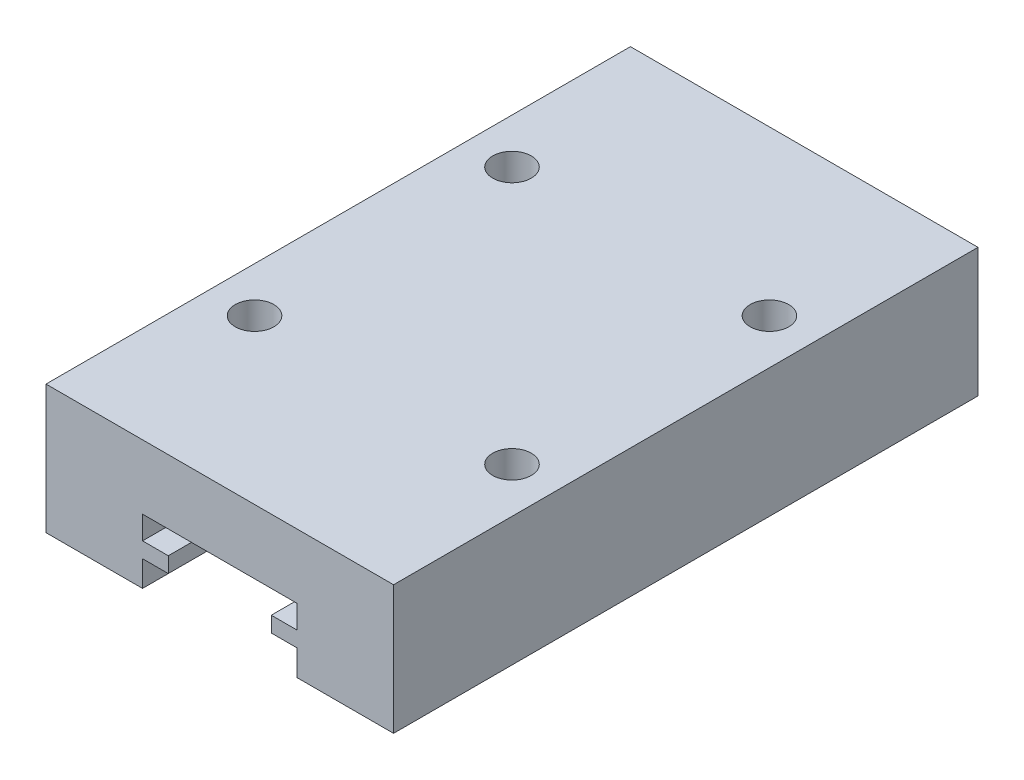
ISO-10303-21;
HEADER;
FILE_DESCRIPTION(('STEP AP214'),'2;1');
FILE_NAME('part.step','',(''),(''),'','','');
FILE_SCHEMA(('AUTOMOTIVE_DESIGN { 1 0 10303 214 1 1 1 1 }'));
ENDSEC;
DATA;
#1=APPLICATION_CONTEXT('core data for automotive mechanical design processes');
#2=APPLICATION_PROTOCOL_DEFINITION('international standard','automotive_design',2000,#1);
#3=PRODUCT_CONTEXT('',#1,'mechanical');
#4=PRODUCT('Part','Part','',(#3));
#5=PRODUCT_RELATED_PRODUCT_CATEGORY('part','',(#4));
#6=PRODUCT_DEFINITION_FORMATION('','',#4);
#7=PRODUCT_DEFINITION_CONTEXT('part definition',#1,'design');
#8=PRODUCT_DEFINITION('design','',#6,#7);
#9=PRODUCT_DEFINITION_SHAPE('','',#8);
#10=(LENGTH_UNIT() NAMED_UNIT(*) SI_UNIT(.MILLI.,.METRE.));
#11=(NAMED_UNIT(*) PLANE_ANGLE_UNIT() SI_UNIT($,.RADIAN.));
#12=(NAMED_UNIT(*) SI_UNIT($,.STERADIAN.) SOLID_ANGLE_UNIT());
#13=UNCERTAINTY_MEASURE_WITH_UNIT(LENGTH_MEASURE(1.E-05),#10,'distance_accuracy_value','');
#14=(GEOMETRIC_REPRESENTATION_CONTEXT(3) GLOBAL_UNCERTAINTY_ASSIGNED_CONTEXT((#13)) GLOBAL_UNIT_ASSIGNED_CONTEXT((#10,
#11,#12)) REPRESENTATION_CONTEXT('',''));
#15=CARTESIAN_POINT('',(0.,0.,0.));
#16=DIRECTION('',(0.,0.,1.));
#17=DIRECTION('',(1.,0.,0.));
#18=AXIS2_PLACEMENT_3D('',#15,#16,#17);
#19=CARTESIAN_POINT('',(-22.7955095785439,0.,45.4));
#20=DIRECTION('',(1.,0.,0.));
#21=DIRECTION('',(0.,0.,-1.));
#22=AXIS2_PLACEMENT_3D('',#19,#20,#21);
#23=PLANE('',#22);
#24=DIRECTION('',(0.,-1.,0.));
#25=VECTOR('',#24,1.);
#26=CARTESIAN_POINT('',(-22.7955095785439,0.,0.));
#27=LINE('',#26,#25);
#28=CARTESIAN_POINT('',(-22.7955095785439,10.,0.));
#29=VERTEX_POINT('',#28);
#30=CARTESIAN_POINT('',(-22.7955095785439,0.,0.));
#31=VERTEX_POINT('',#30);
#32=EDGE_CURVE('E180',#29,#31,#27,.T.);
#33=ORIENTED_EDGE('',*,*,#32,.T.);
#34=DIRECTION('',(0.,0.,-1.));
#35=VECTOR('',#34,1.);
#36=CARTESIAN_POINT('',(-22.7955095785439,0.,45.4));
#37=LINE('',#36,#35);
#38=CARTESIAN_POINT('',(-22.7955095785439,0.,45.4));
#39=VERTEX_POINT('',#38);
#40=EDGE_CURVE('E11',#39,#31,#37,.T.);
#41=ORIENTED_EDGE('',*,*,#40,.F.);
#42=DIRECTION('',(0.,-1.,0.));
#43=VECTOR('',#42,1.);
#44=CARTESIAN_POINT('',(-22.7955095785439,0.,45.4));
#45=LINE('',#44,#43);
#46=CARTESIAN_POINT('',(-22.7955095785439,10.,45.4));
#47=VERTEX_POINT('',#46);
#48=EDGE_CURVE('E211',#47,#39,#45,.T.);
#49=ORIENTED_EDGE('',*,*,#48,.F.);
#50=DIRECTION('',(0.,0.,-1.));
#51=VECTOR('',#50,1.);
#52=CARTESIAN_POINT('',(-22.7955095785439,10.,45.4));
#53=LINE('',#52,#51);
#54=EDGE_CURVE('E176',#47,#29,#53,.T.);
#55=ORIENTED_EDGE('',*,*,#54,.T.);
#56=EDGE_LOOP('',(#33,#41,#49,#55));
#57=FACE_BOUND('',#56,.T.);
#58=ADVANCED_FACE('F36',(#57),#23,.F.);
#59=CARTESIAN_POINT('',(-15.2955095785439,0.,45.4));
#60=DIRECTION('',(0.,1.,0.));
#61=DIRECTION('',(-1.,0.,0.));
#62=AXIS2_PLACEMENT_3D('',#59,#60,#61);
#63=PLANE('',#62);
#64=DIRECTION('',(1.,0.,0.));
#65=VECTOR('',#64,1.);
#66=CARTESIAN_POINT('',(-15.2955095785439,0.,0.));
#67=LINE('',#66,#65);
#68=CARTESIAN_POINT('',(-15.2955095785439,0.,0.));
#69=VERTEX_POINT('',#68);
#70=EDGE_CURVE('E183',#31,#69,#67,.T.);
#71=ORIENTED_EDGE('',*,*,#70,.T.);
#72=DIRECTION('',(0.,0.,-1.));
#73=VECTOR('',#72,1.);
#74=CARTESIAN_POINT('',(-15.2955095785439,0.,45.4));
#75=LINE('',#74,#73);
#76=CARTESIAN_POINT('',(-15.2955095785439,0.,45.4));
#77=VERTEX_POINT('',#76);
#78=EDGE_CURVE('E44',#77,#69,#75,.T.);
#79=ORIENTED_EDGE('',*,*,#78,.F.);
#80=DIRECTION('',(1.,0.,0.));
#81=VECTOR('',#80,1.);
#82=CARTESIAN_POINT('',(-15.2955095785439,0.,45.4));
#83=LINE('',#82,#81);
#84=EDGE_CURVE('E119',#39,#77,#83,.T.);
#85=ORIENTED_EDGE('',*,*,#84,.F.);
#86=ORIENTED_EDGE('',*,*,#40,.T.);
#87=EDGE_LOOP('',(#71,#79,#85,#86));
#88=FACE_BOUND('',#87,.T.);
#89=ADVANCED_FACE('F312',(#88),#63,.F.);
#90=CARTESIAN_POINT('',(-15.2955095785439,2.,45.4));
#91=DIRECTION('',(-1.,0.,0.));
#92=DIRECTION('',(0.,-1.,0.));
#93=AXIS2_PLACEMENT_3D('',#90,#91,#92);
#94=PLANE('',#93);
#95=DIRECTION('',(0.,1.,0.));
#96=VECTOR('',#95,1.);
#97=CARTESIAN_POINT('',(-15.2955095785439,2.,0.));
#98=LINE('',#97,#96);
#99=CARTESIAN_POINT('',(-15.2955095785439,2.,0.));
#100=VERTEX_POINT('',#99);
#101=EDGE_CURVE('E186',#69,#100,#98,.T.);
#102=ORIENTED_EDGE('',*,*,#101,.T.);
#103=DIRECTION('',(0.,0.,-1.));
#104=VECTOR('',#103,1.);
#105=CARTESIAN_POINT('',(-15.2955095785439,2.,45.4));
#106=LINE('',#105,#104);
#107=CARTESIAN_POINT('',(-15.2955095785439,2.,45.4));
#108=VERTEX_POINT('',#107);
#109=EDGE_CURVE('E242',#108,#100,#106,.T.);
#110=ORIENTED_EDGE('',*,*,#109,.F.);
#111=DIRECTION('',(0.,1.,0.));
#112=VECTOR('',#111,1.);
#113=CARTESIAN_POINT('',(-15.2955095785439,2.,45.4));
#114=LINE('',#113,#112);
#115=EDGE_CURVE('E250',#77,#108,#114,.T.);
#116=ORIENTED_EDGE('',*,*,#115,.F.);
#117=ORIENTED_EDGE('',*,*,#78,.T.);
#118=EDGE_LOOP('',(#102,#110,#116,#117));
#119=FACE_BOUND('',#118,.T.);
#120=ADVANCED_FACE('F248',(#119),#94,.F.);
#121=CARTESIAN_POINT('',(-13.2955095785439,2.,45.4));
#122=DIRECTION('',(0.,1.,0.));
#123=DIRECTION('',(0.,0.,1.));
#124=AXIS2_PLACEMENT_3D('',#121,#122,#123);
#125=PLANE('',#124);
#126=DIRECTION('',(1.,0.,0.));
#127=VECTOR('',#126,1.);
#128=CARTESIAN_POINT('',(-13.2955095785439,2.,0.));
#129=LINE('',#128,#127);
#130=CARTESIAN_POINT('',(-13.2955095785439,2.,0.));
#131=VERTEX_POINT('',#130);
#132=EDGE_CURVE('E188',#100,#131,#129,.T.);
#133=ORIENTED_EDGE('',*,*,#132,.T.);
#134=DIRECTION('',(0.,0.,-1.));
#135=VECTOR('',#134,1.);
#136=CARTESIAN_POINT('',(-13.2955095785439,2.,45.4));
#137=LINE('',#136,#135);
#138=CARTESIAN_POINT('',(-13.2955095785439,2.,45.4));
#139=VERTEX_POINT('',#138);
#140=EDGE_CURVE('E239',#139,#131,#137,.T.);
#141=ORIENTED_EDGE('',*,*,#140,.F.);
#142=DIRECTION('',(1.,0.,0.));
#143=VECTOR('',#142,1.);
#144=CARTESIAN_POINT('',(-13.2955095785439,2.,45.4));
#145=LINE('',#144,#143);
#146=EDGE_CURVE('E268',#108,#139,#145,.T.);
#147=ORIENTED_EDGE('',*,*,#146,.F.);
#148=ORIENTED_EDGE('',*,*,#109,.T.);
#149=EDGE_LOOP('',(#133,#141,#147,#148));
#150=FACE_BOUND('',#149,.T.);
#151=ADVANCED_FACE('F259',(#150),#125,.F.);
#152=CARTESIAN_POINT('',(-13.2955095785439,3.2,45.4));
#153=DIRECTION('',(-1.,0.,0.));
#154=DIRECTION('',(0.,-1.,0.));
#155=AXIS2_PLACEMENT_3D('',#152,#153,#154);
#156=PLANE('',#155);
#157=DIRECTION('',(0.,1.,0.));
#158=VECTOR('',#157,1.);
#159=CARTESIAN_POINT('',(-13.2955095785439,3.2,0.));
#160=LINE('',#159,#158);
#161=CARTESIAN_POINT('',(-13.2955095785439,3.2,0.));
#162=VERTEX_POINT('',#161);
#163=EDGE_CURVE('E190',#131,#162,#160,.T.);
#164=ORIENTED_EDGE('',*,*,#163,.T.);
#165=DIRECTION('',(0.,0.,-1.));
#166=VECTOR('',#165,1.);
#167=CARTESIAN_POINT('',(-13.2955095785439,3.2,45.4));
#168=LINE('',#167,#166);
#169=CARTESIAN_POINT('',(-13.2955095785439,3.2,45.4));
#170=VERTEX_POINT('',#169);
#171=EDGE_CURVE('E236',#170,#162,#168,.T.);
#172=ORIENTED_EDGE('',*,*,#171,.F.);
#173=DIRECTION('',(0.,1.,0.));
#174=VECTOR('',#173,1.);
#175=CARTESIAN_POINT('',(-13.2955095785439,3.2,45.4));
#176=LINE('',#175,#174);
#177=EDGE_CURVE('E265',#139,#170,#176,.T.);
#178=ORIENTED_EDGE('',*,*,#177,.F.);
#179=ORIENTED_EDGE('',*,*,#140,.T.);
#180=EDGE_LOOP('',(#164,#172,#178,#179));
#181=FACE_BOUND('',#180,.T.);
#182=ADVANCED_FACE('F263',(#181),#156,.F.);
#183=CARTESIAN_POINT('',(-15.2955095785439,3.2,45.4));
#184=DIRECTION('',(0.,-1.,0.));
#185=DIRECTION('',(0.,0.,-1.));
#186=AXIS2_PLACEMENT_3D('',#183,#184,#185);
#187=PLANE('',#186);
#188=DIRECTION('',(-1.,0.,0.));
#189=VECTOR('',#188,1.);
#190=CARTESIAN_POINT('',(-15.2955095785439,3.2,0.));
#191=LINE('',#190,#189);
#192=CARTESIAN_POINT('',(-15.2955095785439,3.2,0.));
#193=VERTEX_POINT('',#192);
#194=EDGE_CURVE('E192',#162,#193,#191,.T.);
#195=ORIENTED_EDGE('',*,*,#194,.T.);
#196=DIRECTION('',(0.,0.,-1.));
#197=VECTOR('',#196,1.);
#198=CARTESIAN_POINT('',(-15.2955095785439,3.2,45.4));
#199=LINE('',#198,#197);
#200=CARTESIAN_POINT('',(-15.2955095785439,3.2,45.4));
#201=VERTEX_POINT('',#200);
#202=EDGE_CURVE('E233',#201,#193,#199,.T.);
#203=ORIENTED_EDGE('',*,*,#202,.F.);
#204=DIRECTION('',(-1.,0.,0.));
#205=VECTOR('',#204,1.);
#206=CARTESIAN_POINT('',(-15.2955095785439,3.2,45.4));
#207=LINE('',#206,#205);
#208=EDGE_CURVE('E267',#170,#201,#207,.T.);
#209=ORIENTED_EDGE('',*,*,#208,.F.);
#210=ORIENTED_EDGE('',*,*,#171,.T.);
#211=EDGE_LOOP('',(#195,#203,#209,#210));
#212=FACE_BOUND('',#211,.T.);
#213=ADVANCED_FACE('F325',(#212),#187,.F.);
#214=CARTESIAN_POINT('',(-15.2955095785439,5.,45.4));
#215=DIRECTION('',(-1.,0.,0.));
#216=DIRECTION('',(0.,-1.,0.));
#217=AXIS2_PLACEMENT_3D('',#214,#215,#216);
#218=PLANE('',#217);
#219=DIRECTION('',(0.,1.,0.));
#220=VECTOR('',#219,1.);
#221=CARTESIAN_POINT('',(-15.2955095785439,5.,0.));
#222=LINE('',#221,#220);
#223=CARTESIAN_POINT('',(-15.2955095785439,5.,0.));
#224=VERTEX_POINT('',#223);
#225=EDGE_CURVE('E194',#193,#224,#222,.T.);
#226=ORIENTED_EDGE('',*,*,#225,.T.);
#227=DIRECTION('',(0.,0.,-1.));
#228=VECTOR('',#227,1.);
#229=CARTESIAN_POINT('',(-15.2955095785439,5.,45.4));
#230=LINE('',#229,#228);
#231=CARTESIAN_POINT('',(-15.2955095785439,5.,45.4));
#232=VERTEX_POINT('',#231);
#233=EDGE_CURVE('E230',#232,#224,#230,.T.);
#234=ORIENTED_EDGE('',*,*,#233,.F.);
#235=DIRECTION('',(0.,1.,0.));
#236=VECTOR('',#235,1.);
#237=CARTESIAN_POINT('',(-15.2955095785439,5.,45.4));
#238=LINE('',#237,#236);
#239=EDGE_CURVE('E270',#201,#232,#238,.T.);
#240=ORIENTED_EDGE('',*,*,#239,.F.);
#241=ORIENTED_EDGE('',*,*,#202,.T.);
#242=EDGE_LOOP('',(#226,#234,#240,#241));
#243=FACE_BOUND('',#242,.T.);
#244=ADVANCED_FACE('F328',(#243),#218,.F.);
#245=CARTESIAN_POINT('',(-3.29550957854386,5.,45.4));
#246=DIRECTION('',(0.,1.,0.));
#247=DIRECTION('',(-1.,0.,0.));
#248=AXIS2_PLACEMENT_3D('',#245,#246,#247);
#249=PLANE('',#248);
#250=DIRECTION('',(1.,0.,0.));
#251=VECTOR('',#250,1.);
#252=CARTESIAN_POINT('',(-3.29550957854386,5.,0.));
#253=LINE('',#252,#251);
#254=CARTESIAN_POINT('',(-3.29550957854386,5.,0.));
#255=VERTEX_POINT('',#254);
#256=EDGE_CURVE('E196',#224,#255,#253,.T.);
#257=ORIENTED_EDGE('',*,*,#256,.T.);
#258=DIRECTION('',(0.,0.,-1.));
#259=VECTOR('',#258,1.);
#260=CARTESIAN_POINT('',(-3.29550957854386,5.,45.4));
#261=LINE('',#260,#259);
#262=CARTESIAN_POINT('',(-3.29550957854386,5.,45.4));
#263=VERTEX_POINT('',#262);
#264=EDGE_CURVE('E227',#263,#255,#261,.T.);
#265=ORIENTED_EDGE('',*,*,#264,.F.);
#266=DIRECTION('',(1.,0.,0.));
#267=VECTOR('',#266,1.);
#268=CARTESIAN_POINT('',(-3.29550957854386,5.,45.4));
#269=LINE('',#268,#267);
#270=EDGE_CURVE('E276',#232,#263,#269,.T.);
#271=ORIENTED_EDGE('',*,*,#270,.F.);
#272=ORIENTED_EDGE('',*,*,#233,.T.);
#273=EDGE_LOOP('',(#257,#265,#271,#272));
#274=FACE_BOUND('',#273,.T.);
#275=ADVANCED_FACE('F332',(#274),#249,.F.);
#276=CARTESIAN_POINT('',(-3.29550957854386,3.2,45.4));
#277=DIRECTION('',(1.,0.,0.));
#278=DIRECTION('',(0.,0.,-1.));
#279=AXIS2_PLACEMENT_3D('',#276,#277,#278);
#280=PLANE('',#279);
#281=DIRECTION('',(0.,-1.,0.));
#282=VECTOR('',#281,1.);
#283=CARTESIAN_POINT('',(-3.29550957854386,3.2,0.));
#284=LINE('',#283,#282);
#285=CARTESIAN_POINT('',(-3.29550957854386,3.2,0.));
#286=VERTEX_POINT('',#285);
#287=EDGE_CURVE('E198',#255,#286,#284,.T.);
#288=ORIENTED_EDGE('',*,*,#287,.T.);
#289=DIRECTION('',(0.,0.,-1.));
#290=VECTOR('',#289,1.);
#291=CARTESIAN_POINT('',(-3.29550957854386,3.2,45.4));
#292=LINE('',#291,#290);
#293=CARTESIAN_POINT('',(-3.29550957854386,3.2,45.4));
#294=VERTEX_POINT('',#293);
#295=EDGE_CURVE('E224',#294,#286,#292,.T.);
#296=ORIENTED_EDGE('',*,*,#295,.F.);
#297=DIRECTION('',(0.,-1.,0.));
#298=VECTOR('',#297,1.);
#299=CARTESIAN_POINT('',(-3.29550957854386,3.2,45.4));
#300=LINE('',#299,#298);
#301=EDGE_CURVE('E278',#263,#294,#300,.T.);
#302=ORIENTED_EDGE('',*,*,#301,.F.);
#303=ORIENTED_EDGE('',*,*,#264,.T.);
#304=EDGE_LOOP('',(#288,#296,#302,#303));
#305=FACE_BOUND('',#304,.T.);
#306=ADVANCED_FACE('F336',(#305),#280,.F.);
#307=CARTESIAN_POINT('',(-5.29550957854386,3.2,45.4));
#308=DIRECTION('',(0.,-1.,0.));
#309=DIRECTION('',(1.,0.,0.));
#310=AXIS2_PLACEMENT_3D('',#307,#308,#309);
#311=PLANE('',#310);
#312=DIRECTION('',(-1.,0.,0.));
#313=VECTOR('',#312,1.);
#314=CARTESIAN_POINT('',(-5.29550957854386,3.2,0.));
#315=LINE('',#314,#313);
#316=CARTESIAN_POINT('',(-5.29550957854386,3.2,0.));
#317=VERTEX_POINT('',#316);
#318=EDGE_CURVE('E200',#286,#317,#315,.T.);
#319=ORIENTED_EDGE('',*,*,#318,.T.);
#320=DIRECTION('',(0.,0.,-1.));
#321=VECTOR('',#320,1.);
#322=CARTESIAN_POINT('',(-5.29550957854386,3.2,45.4));
#323=LINE('',#322,#321);
#324=CARTESIAN_POINT('',(-5.29550957854386,3.2,45.4));
#325=VERTEX_POINT('',#324);
#326=EDGE_CURVE('E221',#325,#317,#323,.T.);
#327=ORIENTED_EDGE('',*,*,#326,.F.);
#328=DIRECTION('',(-1.,0.,0.));
#329=VECTOR('',#328,1.);
#330=CARTESIAN_POINT('',(-5.29550957854386,3.2,45.4));
#331=LINE('',#330,#329);
#332=EDGE_CURVE('E280',#294,#325,#331,.T.);
#333=ORIENTED_EDGE('',*,*,#332,.F.);
#334=ORIENTED_EDGE('',*,*,#295,.T.);
#335=EDGE_LOOP('',(#319,#327,#333,#334));
#336=FACE_BOUND('',#335,.T.);
#337=ADVANCED_FACE('F340',(#336),#311,.F.);
#338=CARTESIAN_POINT('',(-5.29550957854386,2.,45.4));
#339=DIRECTION('',(1.,0.,0.));
#340=DIRECTION('',(0.,0.,-1.));
#341=AXIS2_PLACEMENT_3D('',#338,#339,#340);
#342=PLANE('',#341);
#343=DIRECTION('',(0.,-1.,0.));
#344=VECTOR('',#343,1.);
#345=CARTESIAN_POINT('',(-5.29550957854386,2.,0.));
#346=LINE('',#345,#344);
#347=CARTESIAN_POINT('',(-5.29550957854386,2.,0.));
#348=VERTEX_POINT('',#347);
#349=EDGE_CURVE('E202',#317,#348,#346,.T.);
#350=ORIENTED_EDGE('',*,*,#349,.T.);
#351=DIRECTION('',(0.,0.,-1.));
#352=VECTOR('',#351,1.);
#353=CARTESIAN_POINT('',(-5.29550957854386,2.,45.4));
#354=LINE('',#353,#352);
#355=CARTESIAN_POINT('',(-5.29550957854386,2.,45.4));
#356=VERTEX_POINT('',#355);
#357=EDGE_CURVE('E218',#356,#348,#354,.T.);
#358=ORIENTED_EDGE('',*,*,#357,.F.);
#359=DIRECTION('',(0.,-1.,0.));
#360=VECTOR('',#359,1.);
#361=CARTESIAN_POINT('',(-5.29550957854386,2.,45.4));
#362=LINE('',#361,#360);
#363=EDGE_CURVE('E282',#325,#356,#362,.T.);
#364=ORIENTED_EDGE('',*,*,#363,.F.);
#365=ORIENTED_EDGE('',*,*,#326,.T.);
#366=EDGE_LOOP('',(#350,#358,#364,#365));
#367=FACE_BOUND('',#366,.T.);
#368=ADVANCED_FACE('F344',(#367),#342,.F.);
#369=CARTESIAN_POINT('',(-3.29550957854386,2.,45.4));
#370=DIRECTION('',(0.,1.,0.));
#371=DIRECTION('',(-1.,0.,0.));
#372=AXIS2_PLACEMENT_3D('',#369,#370,#371);
#373=PLANE('',#372);
#374=DIRECTION('',(1.,0.,0.));
#375=VECTOR('',#374,1.);
#376=CARTESIAN_POINT('',(-3.29550957854386,2.,0.));
#377=LINE('',#376,#375);
#378=CARTESIAN_POINT('',(-3.29550957854386,2.,0.));
#379=VERTEX_POINT('',#378);
#380=EDGE_CURVE('E204',#348,#379,#377,.T.);
#381=ORIENTED_EDGE('',*,*,#380,.T.);
#382=DIRECTION('',(0.,0.,-1.));
#383=VECTOR('',#382,1.);
#384=CARTESIAN_POINT('',(-3.29550957854386,2.,45.4));
#385=LINE('',#384,#383);
#386=CARTESIAN_POINT('',(-3.29550957854386,2.,45.4));
#387=VERTEX_POINT('',#386);
#388=EDGE_CURVE('E215',#387,#379,#385,.T.);
#389=ORIENTED_EDGE('',*,*,#388,.F.);
#390=DIRECTION('',(1.,0.,0.));
#391=VECTOR('',#390,1.);
#392=CARTESIAN_POINT('',(-3.29550957854386,2.,45.4));
#393=LINE('',#392,#391);
#394=EDGE_CURVE('E284',#356,#387,#393,.T.);
#395=ORIENTED_EDGE('',*,*,#394,.F.);
#396=ORIENTED_EDGE('',*,*,#357,.T.);
#397=EDGE_LOOP('',(#381,#389,#395,#396));
#398=FACE_BOUND('',#397,.T.);
#399=ADVANCED_FACE('F290',(#398),#373,.F.);
#400=CARTESIAN_POINT('',(-3.29550957854386,0.,45.4));
#401=DIRECTION('',(1.,0.,0.));
#402=DIRECTION('',(0.,0.,-1.));
#403=AXIS2_PLACEMENT_3D('',#400,#401,#402);
#404=PLANE('',#403);
#405=DIRECTION('',(0.,-1.,0.));
#406=VECTOR('',#405,1.);
#407=CARTESIAN_POINT('',(-3.29550957854386,0.,0.));
#408=LINE('',#407,#406);
#409=CARTESIAN_POINT('',(-3.29550957854386,0.,0.));
#410=VERTEX_POINT('',#409);
#411=EDGE_CURVE('E206',#379,#410,#408,.T.);
#412=ORIENTED_EDGE('',*,*,#411,.T.);
#413=DIRECTION('',(0.,0.,-1.));
#414=VECTOR('',#413,1.);
#415=CARTESIAN_POINT('',(-3.29550957854386,0.,45.4));
#416=LINE('',#415,#414);
#417=CARTESIAN_POINT('',(-3.29550957854386,0.,45.4));
#418=VERTEX_POINT('',#417);
#419=EDGE_CURVE('E171',#418,#410,#416,.T.);
#420=ORIENTED_EDGE('',*,*,#419,.F.);
#421=DIRECTION('',(0.,-1.,0.));
#422=VECTOR('',#421,1.);
#423=CARTESIAN_POINT('',(-3.29550957854386,0.,45.4));
#424=LINE('',#423,#422);
#425=EDGE_CURVE('E162',#387,#418,#424,.T.);
#426=ORIENTED_EDGE('',*,*,#425,.F.);
#427=ORIENTED_EDGE('',*,*,#388,.T.);
#428=EDGE_LOOP('',(#412,#420,#426,#427));
#429=FACE_BOUND('',#428,.T.);
#430=ADVANCED_FACE('F294',(#429),#404,.F.);
#431=CARTESIAN_POINT('',(4.20449042145614,0.,45.4));
#432=DIRECTION('',(0.,1.,0.));
#433=DIRECTION('',(-1.,0.,0.));
#434=AXIS2_PLACEMENT_3D('',#431,#432,#433);
#435=PLANE('',#434);
#436=DIRECTION('',(1.,0.,0.));
#437=VECTOR('',#436,1.);
#438=CARTESIAN_POINT('',(4.20449042145614,0.,0.));
#439=LINE('',#438,#437);
#440=CARTESIAN_POINT('',(4.20449042145614,0.,0.));
#441=VERTEX_POINT('',#440);
#442=EDGE_CURVE('E170',#410,#441,#439,.T.);
#443=ORIENTED_EDGE('',*,*,#442,.T.);
#444=DIRECTION('',(0.,0.,-1.));
#445=VECTOR('',#444,1.);
#446=CARTESIAN_POINT('',(4.20449042145614,0.,45.4));
#447=LINE('',#446,#445);
#448=CARTESIAN_POINT('',(4.20449042145614,0.,45.4));
#449=VERTEX_POINT('',#448);
#450=EDGE_CURVE('E167',#449,#441,#447,.T.);
#451=ORIENTED_EDGE('',*,*,#450,.F.);
#452=DIRECTION('',(1.,0.,0.));
#453=VECTOR('',#452,1.);
#454=CARTESIAN_POINT('',(4.20449042145614,0.,45.4));
#455=LINE('',#454,#453);
#456=EDGE_CURVE('E156',#418,#449,#455,.T.);
#457=ORIENTED_EDGE('',*,*,#456,.F.);
#458=ORIENTED_EDGE('',*,*,#419,.T.);
#459=EDGE_LOOP('',(#443,#451,#457,#458));
#460=FACE_BOUND('',#459,.T.);
#461=ADVANCED_FACE('F168',(#460),#435,.F.);
#462=CARTESIAN_POINT('',(4.20449042145614,10.,45.4));
#463=DIRECTION('',(-1.,0.,0.));
#464=DIRECTION('',(0.,-1.,0.));
#465=AXIS2_PLACEMENT_3D('',#462,#463,#464);
#466=PLANE('',#465);
#467=DIRECTION('',(0.,1.,0.));
#468=VECTOR('',#467,1.);
#469=CARTESIAN_POINT('',(4.20449042145614,10.,0.));
#470=LINE('',#469,#468);
#471=CARTESIAN_POINT('',(4.20449042145614,10.,0.));
#472=VERTEX_POINT('',#471);
#473=EDGE_CURVE('E105',#441,#472,#470,.T.);
#474=ORIENTED_EDGE('',*,*,#473,.T.);
#475=DIRECTION('',(0.,0.,-1.));
#476=VECTOR('',#475,1.);
#477=CARTESIAN_POINT('',(4.20449042145614,10.,45.4));
#478=LINE('',#477,#476);
#479=CARTESIAN_POINT('',(4.20449042145614,10.,45.4));
#480=VERTEX_POINT('',#479);
#481=EDGE_CURVE('E172',#480,#472,#478,.T.);
#482=ORIENTED_EDGE('',*,*,#481,.F.);
#483=DIRECTION('',(0.,1.,0.));
#484=VECTOR('',#483,1.);
#485=CARTESIAN_POINT('',(4.20449042145614,10.,45.4));
#486=LINE('',#485,#484);
#487=EDGE_CURVE('E160',#449,#480,#486,.T.);
#488=ORIENTED_EDGE('',*,*,#487,.F.);
#489=ORIENTED_EDGE('',*,*,#450,.T.);
#490=EDGE_LOOP('',(#474,#482,#488,#489));
#491=FACE_BOUND('',#490,.T.);
#492=ADVANCED_FACE('F174',(#491),#466,.F.);
#493=CARTESIAN_POINT('',(-22.7955095785439,10.,45.4));
#494=DIRECTION('',(0.,-1.,0.));
#495=DIRECTION('',(0.,0.,-1.));
#496=AXIS2_PLACEMENT_3D('',#493,#494,#495);
#497=PLANE('',#496);
#498=CARTESIAN_POINT('',(0.704490421456135,10.,32.7));
#499=DIRECTION('',(0.,1.,0.));
#500=DIRECTION('',(0.,0.,1.));
#501=AXIS2_PLACEMENT_3D('',#498,#499,#500);
#502=CIRCLE('',#501,1.5);
#503=CARTESIAN_POINT('',(0.704490421456135,10.,34.2));
#504=VERTEX_POINT('',#503);
#505=EDGE_CURVE('E467',#504,#504,#502,.T.);
#506=ORIENTED_EDGE('',*,*,#505,.F.);
#507=EDGE_LOOP('',(#506));
#508=FACE_BOUND('',#507,.T.);
#509=CARTESIAN_POINT('',(0.704490421456135,10.,12.7));
#510=DIRECTION('',(0.,1.,0.));
#511=DIRECTION('',(0.,0.,1.));
#512=AXIS2_PLACEMENT_3D('',#509,#510,#511);
#513=CIRCLE('',#512,1.5);
#514=CARTESIAN_POINT('',(0.704490421456135,10.,14.2));
#515=VERTEX_POINT('',#514);
#516=EDGE_CURVE('E466',#515,#515,#513,.T.);
#517=ORIENTED_EDGE('',*,*,#516,.F.);
#518=EDGE_LOOP('',(#517));
#519=FACE_BOUND('',#518,.T.);
#520=CARTESIAN_POINT('',(-19.2955095785439,10.,12.7));
#521=DIRECTION('',(0.,1.,0.));
#522=DIRECTION('',(0.,0.,1.));
#523=AXIS2_PLACEMENT_3D('',#520,#521,#522);
#524=CIRCLE('',#523,1.5);
#525=CARTESIAN_POINT('',(-19.2955095785439,10.,14.2));
#526=VERTEX_POINT('',#525);
#527=EDGE_CURVE('E486',#526,#526,#524,.T.);
#528=ORIENTED_EDGE('',*,*,#527,.F.);
#529=EDGE_LOOP('',(#528));
#530=FACE_BOUND('',#529,.T.);
#531=CARTESIAN_POINT('',(-19.2955095785439,10.,32.7));
#532=DIRECTION('',(0.,1.,0.));
#533=DIRECTION('',(0.,0.,1.));
#534=AXIS2_PLACEMENT_3D('',#531,#532,#533);
#535=CIRCLE('',#534,1.5);
#536=CARTESIAN_POINT('',(-19.2955095785439,10.,34.2));
#537=VERTEX_POINT('',#536);
#538=EDGE_CURVE('E478',#537,#537,#535,.T.);
#539=ORIENTED_EDGE('',*,*,#538,.F.);
#540=EDGE_LOOP('',(#539));
#541=FACE_BOUND('',#540,.T.);
#542=DIRECTION('',(-1.,0.,0.));
#543=VECTOR('',#542,1.);
#544=CARTESIAN_POINT('',(-22.7955095785439,10.,0.));
#545=LINE('',#544,#543);
#546=EDGE_CURVE('E111',#472,#29,#545,.T.);
#547=ORIENTED_EDGE('',*,*,#546,.T.);
#548=ORIENTED_EDGE('',*,*,#54,.F.);
#549=DIRECTION('',(-1.,0.,0.));
#550=VECTOR('',#549,1.);
#551=CARTESIAN_POINT('',(-22.7955095785439,10.,45.4));
#552=LINE('',#551,#550);
#553=EDGE_CURVE('E52',#480,#47,#552,.T.);
#554=ORIENTED_EDGE('',*,*,#553,.F.);
#555=ORIENTED_EDGE('',*,*,#481,.T.);
#556=EDGE_LOOP('',(#547,#548,#554,#555));
#557=FACE_BOUND('',#556,.T.);
#558=ADVANCED_FACE('F298',(#508,#519,#530,#541,#557),#497,.F.);
#559=CARTESIAN_POINT('',(0.,0.,45.4));
#560=DIRECTION('',(0.,0.,-1.));
#561=DIRECTION('',(-1.,0.,0.));
#562=AXIS2_PLACEMENT_3D('',#559,#560,#561);
#563=PLANE('',#562);
#564=ORIENTED_EDGE('',*,*,#48,.T.);
#565=ORIENTED_EDGE('',*,*,#84,.T.);
#566=ORIENTED_EDGE('',*,*,#115,.T.);
#567=ORIENTED_EDGE('',*,*,#146,.T.);
#568=ORIENTED_EDGE('',*,*,#177,.T.);
#569=ORIENTED_EDGE('',*,*,#208,.T.);
#570=ORIENTED_EDGE('',*,*,#239,.T.);
#571=ORIENTED_EDGE('',*,*,#270,.T.);
#572=ORIENTED_EDGE('',*,*,#301,.T.);
#573=ORIENTED_EDGE('',*,*,#332,.T.);
#574=ORIENTED_EDGE('',*,*,#363,.T.);
#575=ORIENTED_EDGE('',*,*,#394,.T.);
#576=ORIENTED_EDGE('',*,*,#425,.T.);
#577=ORIENTED_EDGE('',*,*,#456,.T.);
#578=ORIENTED_EDGE('',*,*,#487,.T.);
#579=ORIENTED_EDGE('',*,*,#553,.T.);
#580=EDGE_LOOP('',(#564,#565,#566,#567,#568,#569,#570,#571,#572,#573,#574,#575,#576,#577,#578,#579));
#581=FACE_BOUND('',#580,.T.);
#582=ADVANCED_FACE('F158',(#581),#563,.F.);
#583=CARTESIAN_POINT('',(0.,0.,0.));
#584=DIRECTION('',(0.,0.,-1.));
#585=DIRECTION('',(-1.,0.,0.));
#586=AXIS2_PLACEMENT_3D('',#583,#584,#585);
#587=PLANE('',#586);
#588=ORIENTED_EDGE('',*,*,#32,.F.);
#589=ORIENTED_EDGE('',*,*,#546,.F.);
#590=ORIENTED_EDGE('',*,*,#473,.F.);
#591=ORIENTED_EDGE('',*,*,#442,.F.);
#592=ORIENTED_EDGE('',*,*,#411,.F.);
#593=ORIENTED_EDGE('',*,*,#380,.F.);
#594=ORIENTED_EDGE('',*,*,#349,.F.);
#595=ORIENTED_EDGE('',*,*,#318,.F.);
#596=ORIENTED_EDGE('',*,*,#287,.F.);
#597=ORIENTED_EDGE('',*,*,#256,.F.);
#598=ORIENTED_EDGE('',*,*,#225,.F.);
#599=ORIENTED_EDGE('',*,*,#194,.F.);
#600=ORIENTED_EDGE('',*,*,#163,.F.);
#601=ORIENTED_EDGE('',*,*,#132,.F.);
#602=ORIENTED_EDGE('',*,*,#101,.F.);
#603=ORIENTED_EDGE('',*,*,#70,.F.);
#604=EDGE_LOOP('',(#588,#589,#590,#591,#592,#593,#594,#595,#596,#597,#598,#599,#600,#601,#602,#603));
#605=FACE_BOUND('',#604,.T.);
#606=ADVANCED_FACE('F254',(#605),#587,.T.);
#607=CARTESIAN_POINT('',(-19.2955095785439,6.5,32.7));
#608=DIRECTION('',(0.,1.,0.));
#609=DIRECTION('',(0.,0.,1.));
#610=AXIS2_PLACEMENT_3D('',#607,#608,#609);
#611=CYLINDRICAL_SURFACE('',#610,1.5);
#612=CARTESIAN_POINT('',(-19.2955095785439,6.5,32.7));
#613=DIRECTION('',(0.,1.,0.));
#614=DIRECTION('',(0.,0.,1.));
#615=AXIS2_PLACEMENT_3D('',#612,#613,#614);
#616=CIRCLE('',#615,1.5);
#617=CARTESIAN_POINT('',(-19.2955095785439,6.5,34.2));
#618=VERTEX_POINT('',#617);
#619=EDGE_CURVE('E184',#618,#618,#616,.T.);
#620=ORIENTED_EDGE('',*,*,#619,.F.);
#621=EDGE_LOOP('',(#620));
#622=FACE_BOUND('',#621,.T.);
#623=ORIENTED_EDGE('',*,*,#538,.T.);
#624=EDGE_LOOP('',(#623));
#625=FACE_BOUND('',#624,.T.);
#626=ADVANCED_FACE('F377',(#622,#625),#611,.F.);
#627=CARTESIAN_POINT('',(-19.2955095785439,6.5,32.7));
#628=DIRECTION('',(0.,1.,0.));
#629=DIRECTION('',(0.,0.,1.));
#630=AXIS2_PLACEMENT_3D('',#627,#628,#629);
#631=PLANE('',#630);
#632=ORIENTED_EDGE('',*,*,#619,.T.);
#633=EDGE_LOOP('',(#632));
#634=FACE_BOUND('',#633,.T.);
#635=ADVANCED_FACE('F389',(#634),#631,.T.);
#636=CARTESIAN_POINT('',(-19.2955095785439,6.5,12.7));
#637=DIRECTION('',(0.,1.,0.));
#638=DIRECTION('',(0.,0.,1.));
#639=AXIS2_PLACEMENT_3D('',#636,#637,#638);
#640=CYLINDRICAL_SURFACE('',#639,1.5);
#641=CARTESIAN_POINT('',(-19.2955095785439,6.5,12.7));
#642=DIRECTION('',(0.,1.,0.));
#643=DIRECTION('',(0.,0.,1.));
#644=AXIS2_PLACEMENT_3D('',#641,#642,#643);
#645=CIRCLE('',#644,1.5);
#646=CARTESIAN_POINT('',(-19.2955095785439,6.5,14.2));
#647=VERTEX_POINT('',#646);
#648=EDGE_CURVE('E481',#647,#647,#645,.T.);
#649=ORIENTED_EDGE('',*,*,#648,.F.);
#650=EDGE_LOOP('',(#649));
#651=FACE_BOUND('',#650,.T.);
#652=ORIENTED_EDGE('',*,*,#527,.T.);
#653=EDGE_LOOP('',(#652));
#654=FACE_BOUND('',#653,.T.);
#655=ADVANCED_FACE('F399',(#651,#654),#640,.F.);
#656=CARTESIAN_POINT('',(-19.2955095785439,6.5,12.7));
#657=DIRECTION('',(0.,1.,0.));
#658=DIRECTION('',(0.,0.,1.));
#659=AXIS2_PLACEMENT_3D('',#656,#657,#658);
#660=PLANE('',#659);
#661=ORIENTED_EDGE('',*,*,#648,.T.);
#662=EDGE_LOOP('',(#661));
#663=FACE_BOUND('',#662,.T.);
#664=ADVANCED_FACE('F409',(#663),#660,.T.);
#665=CARTESIAN_POINT('',(0.704490421456135,6.5,12.7));
#666=DIRECTION('',(0.,1.,0.));
#667=DIRECTION('',(0.,0.,1.));
#668=AXIS2_PLACEMENT_3D('',#665,#666,#667);
#669=CYLINDRICAL_SURFACE('',#668,1.5);
#670=CARTESIAN_POINT('',(0.704490421456135,6.5,12.7));
#671=DIRECTION('',(0.,1.,0.));
#672=DIRECTION('',(0.,0.,1.));
#673=AXIS2_PLACEMENT_3D('',#670,#671,#672);
#674=CIRCLE('',#673,1.5);
#675=CARTESIAN_POINT('',(0.704490421456135,6.5,14.2));
#676=VERTEX_POINT('',#675);
#677=EDGE_CURVE('E470',#676,#676,#674,.T.);
#678=ORIENTED_EDGE('',*,*,#677,.F.);
#679=EDGE_LOOP('',(#678));
#680=FACE_BOUND('',#679,.T.);
#681=ORIENTED_EDGE('',*,*,#516,.T.);
#682=EDGE_LOOP('',(#681));
#683=FACE_BOUND('',#682,.T.);
#684=ADVANCED_FACE('F419',(#680,#683),#669,.F.);
#685=CARTESIAN_POINT('',(0.704490421456135,6.5,12.7));
#686=DIRECTION('',(0.,1.,0.));
#687=DIRECTION('',(0.,0.,1.));
#688=AXIS2_PLACEMENT_3D('',#685,#686,#687);
#689=PLANE('',#688);
#690=ORIENTED_EDGE('',*,*,#677,.T.);
#691=EDGE_LOOP('',(#690));
#692=FACE_BOUND('',#691,.T.);
#693=ADVANCED_FACE('F429',(#692),#689,.T.);
#694=CARTESIAN_POINT('',(0.704490421456135,6.5,32.7));
#695=DIRECTION('',(0.,1.,0.));
#696=DIRECTION('',(0.,0.,1.));
#697=AXIS2_PLACEMENT_3D('',#694,#695,#696);
#698=CYLINDRICAL_SURFACE('',#697,1.5);
#699=CARTESIAN_POINT('',(0.704490421456135,6.5,32.7));
#700=DIRECTION('',(0.,1.,0.));
#701=DIRECTION('',(0.,0.,1.));
#702=AXIS2_PLACEMENT_3D('',#699,#700,#701);
#703=CIRCLE('',#702,1.5);
#704=CARTESIAN_POINT('',(0.704490421456135,6.5,34.2));
#705=VERTEX_POINT('',#704);
#706=EDGE_CURVE('E465',#705,#705,#703,.T.);
#707=ORIENTED_EDGE('',*,*,#706,.F.);
#708=EDGE_LOOP('',(#707));
#709=FACE_BOUND('',#708,.T.);
#710=ORIENTED_EDGE('',*,*,#505,.T.);
#711=EDGE_LOOP('',(#710));
#712=FACE_BOUND('',#711,.T.);
#713=ADVANCED_FACE('F439',(#709,#712),#698,.F.);
#714=CARTESIAN_POINT('',(0.704490421456135,6.5,32.7));
#715=DIRECTION('',(0.,1.,0.));
#716=DIRECTION('',(0.,0.,1.));
#717=AXIS2_PLACEMENT_3D('',#714,#715,#716);
#718=PLANE('',#717);
#719=ORIENTED_EDGE('',*,*,#706,.T.);
#720=EDGE_LOOP('',(#719));
#721=FACE_BOUND('',#720,.T.);
#722=ADVANCED_FACE('F449',(#721),#718,.T.);
#723=CLOSED_SHELL('',(#58,#89,#120,#151,#182,#213,#244,#275,#306,#337,#368,#399,#430,#461,#492,
#558,#582,#606,#626,#635,#655,#664,#684,#693,#713,#722));
#724=MANIFOLD_SOLID_BREP('B2',#723);
#725=ADVANCED_BREP_SHAPE_REPRESENTATION('',(#18,#724),#14);
#726=SHAPE_DEFINITION_REPRESENTATION(#9,#725);
ENDSEC;
END-ISO-10303-21;
